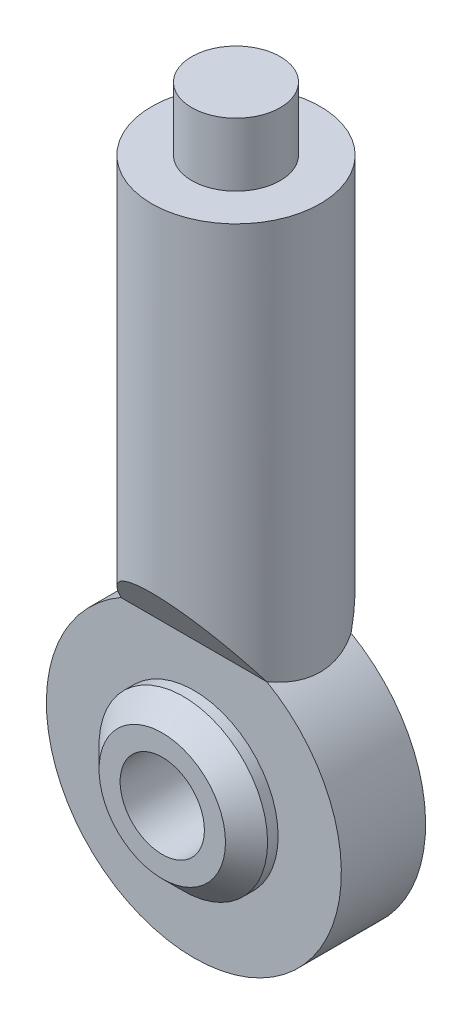
ISO-10303-21;
HEADER;
FILE_DESCRIPTION(('STEP AP214'),'2;1');
FILE_NAME('part.step','',(''),(''),'','','');
FILE_SCHEMA(('AUTOMOTIVE_DESIGN { 1 0 10303 214 1 1 1 1 }'));
ENDSEC;
DATA;
#1=APPLICATION_CONTEXT('core data for automotive mechanical design processes');
#2=APPLICATION_PROTOCOL_DEFINITION('international standard','automotive_design',2000,#1);
#3=PRODUCT_CONTEXT('',#1,'mechanical');
#4=PRODUCT('Part','Part','',(#3));
#5=PRODUCT_RELATED_PRODUCT_CATEGORY('part','',(#4));
#6=PRODUCT_DEFINITION_FORMATION('','',#4);
#7=PRODUCT_DEFINITION_CONTEXT('part definition',#1,'design');
#8=PRODUCT_DEFINITION('design','',#6,#7);
#9=PRODUCT_DEFINITION_SHAPE('','',#8);
#10=(LENGTH_UNIT() NAMED_UNIT(*) SI_UNIT(.MILLI.,.METRE.));
#11=(NAMED_UNIT(*) PLANE_ANGLE_UNIT() SI_UNIT($,.RADIAN.));
#12=(NAMED_UNIT(*) SI_UNIT($,.STERADIAN.) SOLID_ANGLE_UNIT());
#13=UNCERTAINTY_MEASURE_WITH_UNIT(LENGTH_MEASURE(1.E-05),#10,'distance_accuracy_value','');
#14=(GEOMETRIC_REPRESENTATION_CONTEXT(3) GLOBAL_UNCERTAINTY_ASSIGNED_CONTEXT((#13)) GLOBAL_UNIT_ASSIGNED_CONTEXT((#10,
#11,#12)) REPRESENTATION_CONTEXT('',''));
#15=CARTESIAN_POINT('',(0.,0.,0.));
#16=DIRECTION('',(0.,0.,1.));
#17=DIRECTION('',(1.,0.,0.));
#18=AXIS2_PLACEMENT_3D('',#15,#16,#17);
#19=CARTESIAN_POINT('',(0.,0.,2.));
#20=DIRECTION('',(0.,0.,1.));
#21=DIRECTION('',(1.,0.,0.));
#22=AXIS2_PLACEMENT_3D('',#19,#20,#21);
#23=PLANE('',#22);
#24=CARTESIAN_POINT('',(0.,0.,2.));
#25=DIRECTION('',(0.,0.,1.));
#26=DIRECTION('',(1.,0.,0.));
#27=AXIS2_PLACEMENT_3D('',#24,#25,#26);
#28=CIRCLE('',#27,7.);
#29=CARTESIAN_POINT('',(-3.46410161513777,6.08276253029822,2.00000000000002));
#30=VERTEX_POINT('',#29);
#31=CARTESIAN_POINT('',(3.46410161513777,6.08276253029822,2.00000000000002));
#32=VERTEX_POINT('',#31);
#33=EDGE_CURVE('E52',#30,#32,#28,.T.);
#34=ORIENTED_EDGE('',*,*,#33,.T.);
#35=DIRECTION('',(1.,0.,0.));
#36=VECTOR('',#35,1.);
#37=CARTESIAN_POINT('',(-5.,6.08276253029822,2.00000000000002));
#38=LINE('',#37,#36);
#39=EDGE_CURVE('E75',#30,#32,#38,.T.);
#40=ORIENTED_EDGE('',*,*,#39,.F.);
#41=EDGE_LOOP('',(#34,#40));
#42=FACE_BOUND('',#41,.T.);
#43=CARTESIAN_POINT('',(0.,0.,2.));
#44=DIRECTION('',(0.,0.,1.));
#45=DIRECTION('',(1.,0.,0.));
#46=AXIS2_PLACEMENT_3D('',#43,#44,#45);
#47=CIRCLE('',#46,4.);
#48=CARTESIAN_POINT('',(4.,0.,2.));
#49=VERTEX_POINT('',#48);
#50=EDGE_CURVE('E88',#49,#49,#47,.T.);
#51=ORIENTED_EDGE('',*,*,#50,.F.);
#52=EDGE_LOOP('',(#51));
#53=FACE_BOUND('',#52,.T.);
#54=ADVANCED_FACE('F34',(#42,#53),#23,.T.);
#55=CARTESIAN_POINT('',(0.,0.,-2.));
#56=DIRECTION('',(0.,0.,1.));
#57=DIRECTION('',(1.,0.,0.));
#58=AXIS2_PLACEMENT_3D('',#55,#56,#57);
#59=PLANE('',#58);
#60=DIRECTION('',(1.,0.,0.));
#61=VECTOR('',#60,1.);
#62=CARTESIAN_POINT('',(-5.,6.08276253029822,-1.99999999999998));
#63=LINE('',#62,#61);
#64=CARTESIAN_POINT('',(-3.46410161513775,6.08276253029822,-1.99999999999998));
#65=VERTEX_POINT('',#64);
#66=CARTESIAN_POINT('',(3.46410161513775,6.08276253029822,-1.99999999999998));
#67=VERTEX_POINT('',#66);
#68=EDGE_CURVE('E76',#65,#67,#63,.T.);
#69=ORIENTED_EDGE('',*,*,#68,.T.);
#70=CARTESIAN_POINT('',(0.,0.,-2.));
#71=DIRECTION('',(0.,0.,1.));
#72=DIRECTION('',(1.,0.,0.));
#73=AXIS2_PLACEMENT_3D('',#70,#71,#72);
#74=CIRCLE('',#73,7.);
#75=EDGE_CURVE('E85',#65,#67,#74,.T.);
#76=ORIENTED_EDGE('',*,*,#75,.F.);
#77=EDGE_LOOP('',(#69,#76));
#78=FACE_BOUND('',#77,.T.);
#79=CARTESIAN_POINT('',(0.,0.,-2.));
#80=DIRECTION('',(0.,0.,1.));
#81=DIRECTION('',(1.,0.,0.));
#82=AXIS2_PLACEMENT_3D('',#79,#80,#81);
#83=CIRCLE('',#82,4.);
#84=CARTESIAN_POINT('',(4.,0.,-2.));
#85=VERTEX_POINT('',#84);
#86=EDGE_CURVE('E93',#85,#85,#83,.F.);
#87=ORIENTED_EDGE('',*,*,#86,.F.);
#88=EDGE_LOOP('',(#87));
#89=FACE_BOUND('',#88,.T.);
#90=ADVANCED_FACE('F86',(#78,#89),#59,.F.);
#91=CARTESIAN_POINT('',(0.,0.,2.));
#92=DIRECTION('',(0.,0.,-1.));
#93=DIRECTION('',(-1.,0.,0.));
#94=AXIS2_PLACEMENT_3D('',#91,#92,#93);
#95=CYLINDRICAL_SURFACE('',#94,7.);
#96=ORIENTED_EDGE('',*,*,#33,.F.);
#97=CARTESIAN_POINT('',(0.,7.,4.00000000000003));
#98=CARTESIAN_POINT('',(-0.103174353693697,6.99999916766608,3.99999907377856));
#99=CARTESIAN_POINT('',(-0.206380943793601,6.99771279419803,3.99600161518895));
#100=CARTESIAN_POINT('',(-0.412022231403471,6.98862259173911,3.98006116827584));
#101=CARTESIAN_POINT('',(-0.514456405807249,6.9818159384365,3.96811321240036));
#102=CARTESIAN_POINT('',(-0.717934780638677,6.96383614374592,3.93639259035255));
#103=CARTESIAN_POINT('',(-0.818975800015571,6.95265431743131,3.91660435987073));
#104=CARTESIAN_POINT('',(-1.01874471471558,6.92620670688288,3.86945904381504));
#105=CARTESIAN_POINT('',(-1.11747160371512,6.91093918050343,3.84209872932827));
#106=CARTESIAN_POINT('',(-1.40816161924452,6.85970259630012,3.7494279546662));
#107=CARTESIAN_POINT('',(-1.59584032587964,6.81818653388811,3.67333513050477));
#108=CARTESIAN_POINT('',(-1.95516204193538,6.72398397587056,3.49537340911178));
#109=CARTESIAN_POINT('',(-2.12680950125059,6.67130059340362,3.39351169400328));
#110=CARTESIAN_POINT('',(-2.46335779064466,6.55482935189651,3.15863044004658));
#111=CARTESIAN_POINT('',(-2.62687541249465,6.4905142322253,3.02389160124483));
#112=CARTESIAN_POINT('',(-2.93033153816757,6.35928931111331,2.73088476818159));
#113=CARTESIAN_POINT('',(-3.07024197621333,6.29237653599831,2.5725891828547));
#114=CARTESIAN_POINT('',(-3.33788766479094,6.15495683988651,2.21660733216358));
#115=CARTESIAN_POINT('',(-3.46264734932395,6.08484959478129,2.01650979018382));
#116=CARTESIAN_POINT('',(-3.67622523435091,5.95826038292871,1.59409940999441));
#117=CARTESIAN_POINT('',(-3.76509784562976,5.90175784209801,1.37182084496662));
#118=CARTESIAN_POINT('',(-3.88718686207776,5.82184477812116,0.961709681430863));
#119=CARTESIAN_POINT('',(-3.92836679668126,5.7938785104293,0.777136979922026));
#120=CARTESIAN_POINT('',(-3.98421352589058,5.75562678316024,0.402300520350382));
#121=CARTESIAN_POINT('',(-3.99890874126274,5.74532237121861,0.212043085805393));
#122=CARTESIAN_POINT('',(-4.000975196418,5.74388373656896,-0.168949347665514));
#123=CARTESIAN_POINT('',(-3.9883091206227,5.75277569403422,-0.359684643988187));
#124=CARTESIAN_POINT('',(-3.93632981744011,5.78845897302995,-0.735805094015829));
#125=CARTESIAN_POINT('',(-3.89699825572749,5.81526260986988,-0.921186475046951));
#126=CARTESIAN_POINT('',(-3.79383546739156,5.88307389939548,-1.28132955014227));
#127=CARTESIAN_POINT('',(-3.73009950434547,5.92402626197588,-1.45612951440863));
#128=CARTESIAN_POINT('',(-3.58033837481383,6.01571820888122,-1.79310086238778));
#129=CARTESIAN_POINT('',(-3.49430468035283,6.06646153595043,-1.9552673833917));
#130=CARTESIAN_POINT('',(-3.28648201894194,6.18185421346707,-2.28994078044742));
#131=CARTESIAN_POINT('',(-3.1611726088396,6.24742890906936,-2.45994019405351));
#132=CARTESIAN_POINT('',(-2.88547978627879,6.37944698360955,-2.77818874560388));
#133=CARTESIAN_POINT('',(-2.73507500002898,6.44589105816034,-2.92641913874011));
#134=CARTESIAN_POINT('',(-2.48331031323023,6.54542571666137,-3.13799899016948));
#135=CARTESIAN_POINT('',(-2.38969010220767,6.58026752098845,-3.2098883108521));
#136=CARTESIAN_POINT('',(-2.19586698303155,6.64745587466658,-3.34546570152993));
#137=CARTESIAN_POINT('',(-2.09566676634966,6.67980343263155,-3.40915709361981));
#138=CARTESIAN_POINT('',(-1.889204002549,6.74110581212484,-3.52775900492854));
#139=CARTESIAN_POINT('',(-1.78294128516186,6.77006053829395,-3.58266927736037));
#140=CARTESIAN_POINT('',(-1.56508258052671,6.82371510380378,-3.68305410070041));
#141=CARTESIAN_POINT('',(-1.45348987750213,6.84841752119956,-3.72853437219748));
#142=CARTESIAN_POINT('',(-1.2335757790331,6.89129649283952,-3.80669931479188));
#143=CARTESIAN_POINT('',(-1.12555499053737,6.90980443827147,-3.84004766376687));
#144=CARTESIAN_POINT('',(-0.906444721241725,6.94194552986212,-3.89758615921543));
#145=CARTESIAN_POINT('',(-0.795356928634575,6.95558130240596,-3.92178124024863));
#146=CARTESIAN_POINT('',(-0.571076021606556,6.97757559140464,-3.96065880106725));
#147=CARTESIAN_POINT('',(-0.457884145982404,6.98593711776119,-3.97534670652386));
#148=CARTESIAN_POINT('',(-0.230391688469561,6.99713394609541,-3.99499057470808));
#149=CARTESIAN_POINT('',(-0.116091232128093,6.99996986667267,-3.99994762681932));
#150=CARTESIAN_POINT('',(0.098598515755152,7.00002603570934,-4.00004524614223));
#151=CARTESIAN_POINT('',(0.198989300897778,6.99788721407676,-3.99630619612816));
#152=CARTESIAN_POINT('',(0.399056378144481,6.98933343073185,-3.98130882132309));
#153=CARTESIAN_POINT('',(0.498732436984928,6.98291713194041,-3.97004814537565));
#154=CARTESIAN_POINT('',(0.696577503138301,6.96596218341932,-3.94014996542461));
#155=CARTESIAN_POINT('',(0.794747081263238,6.95542513725049,-3.92151533091342));
#156=CARTESIAN_POINT('',(0.988966675044392,6.93048013582528,-3.87709770270347));
#157=CARTESIAN_POINT('',(1.08501585796256,6.91607068803824,-3.85131195264434));
#158=CARTESIAN_POINT('',(1.36702487624933,6.86784025244504,-3.76425178907955));
#159=CARTESIAN_POINT('',(1.54910864022513,6.82881174027116,-3.69292384409024));
#160=CARTESIAN_POINT('',(1.89874210569062,6.73998795964161,-3.52596286256885));
#161=CARTESIAN_POINT('',(2.06628829476744,6.69019009930531,-3.43032397409962));
#162=CARTESIAN_POINT('',(2.40101022734591,6.57794997192013,-3.2062140714796));
#163=CARTESIAN_POINT('',(2.56633212812789,6.51473109707346,-3.07536179531594));
#164=CARTESIAN_POINT('',(2.87394702055108,6.38501165185068,-2.79007620556994));
#165=CARTESIAN_POINT('',(3.01621327559793,6.31850738648143,-2.63561591232811));
#166=CARTESIAN_POINT('',(3.28985374296218,6.1808435227324,-2.28719509976019));
#167=CARTESIAN_POINT('',(3.41824351694382,6.10999195942493,-2.0907504418171));
#168=CARTESIAN_POINT('',(3.63986774300697,5.98062693471643,-1.67529069821978));
#169=CARTESIAN_POINT('',(3.73314891565779,5.92209712227822,-1.4563061054957));
#170=CARTESIAN_POINT('',(3.86444214295347,5.83702467135119,-1.04952947883425));
#171=CARTESIAN_POINT('',(3.90999905451075,5.80632211246573,-0.865047018314353));
#172=CARTESIAN_POINT('',(3.9744867486248,5.76238064526141,-0.489531814935945));
#173=CARTESIAN_POINT('',(3.99344782797955,5.74912186682822,-0.298506779735318));
#174=CARTESIAN_POINT('',(4.00370381772298,5.74198624338643,0.0850455450714547));
#175=CARTESIAN_POINT('',(3.9949430276323,5.74814842005171,0.277575082842396));
#176=CARTESIAN_POINT('',(3.95016772474909,5.77900279264678,0.65795427962015));
#177=CARTESIAN_POINT('',(3.9141359745247,5.80370670835904,0.84580090104658));
#178=CARTESIAN_POINT('',(3.81754070421717,5.86767618941698,1.20875134639438));
#179=CARTESIAN_POINT('',(3.75741242514338,5.90668241023302,1.38401941400972));
#180=CARTESIAN_POINT('',(3.61484445738469,5.99499093748335,1.72239789386604));
#181=CARTESIAN_POINT('',(3.53239654118209,6.04429703915073,1.88550379452539));
#182=CARTESIAN_POINT('',(3.33286050522202,6.15687101376706,2.22168794717743));
#183=CARTESIAN_POINT('',(3.21239325811873,6.22111967308758,2.39243428434695));
#184=CARTESIAN_POINT('',(2.94678350974008,6.35125248551337,2.71291013955076));
#185=CARTESIAN_POINT('',(2.80161960176933,6.41713801476199,2.86262121722511));
#186=CARTESIAN_POINT('',(2.46904766832851,6.55284552282303,3.15574307766574));
#187=CARTESIAN_POINT('',(2.27863050588138,6.62213671268147,3.29605019117405));
#188=CARTESIAN_POINT('',(1.97466957376768,6.71654843840246,3.48062955700553));
#189=CARTESIAN_POINT('',(1.87025550480297,6.74643988436931,3.53785722937425));
#190=CARTESIAN_POINT('',(1.65585314541166,6.80223377050488,3.64312862221177));
#191=CARTESIAN_POINT('',(1.54586640130947,6.82813730928139,3.69117487290574));
#192=CARTESIAN_POINT('',(1.34112548315165,6.87097539991195,3.76977226195681));
#193=CARTESIAN_POINT('',(1.24713982863986,6.88868575445997,3.80191515074172));
#194=CARTESIAN_POINT('',(1.05647742318429,6.92049045413031,3.85924321854376));
#195=CARTESIAN_POINT('',(0.959801151524329,6.9345854387517,3.88442962810746));
#196=CARTESIAN_POINT('',(0.764604083132345,6.95880963464549,3.92751165707027));
#197=CARTESIAN_POINT('',(0.66608841404705,6.96894852493489,3.94542507505117));
#198=CARTESIAN_POINT('',(0.467694279786065,6.98506655367338,3.97382595093296));
#199=CARTESIAN_POINT('',(0.367816622968048,6.99104805863874,3.98431763358274));
#200=CARTESIAN_POINT('',(0.223113454646585,6.99658555791355,3.99402226844822));
#201=CARTESIAN_POINT('',(0.178534436572916,6.99786511874742,3.99626297726964));
#202=CARTESIAN_POINT('',(0.0893056299289705,6.99957256458765,3.99925212176124));
#203=CARTESIAN_POINT('',(0.0446558344262021,7.00000036025005,4.0000004008864));
#204=CARTESIAN_POINT('',(0.,7.,4.00000000000003));
#205=B_SPLINE_CURVE_WITH_KNOTS('',3,(#97,#98,#99,#100,#101,#102,#103,#104,#105,#106,#107,#108,
#109,#110,#111,#112,#113,#114,#115,#116,#117,#118,#119,#120,#121,#122,#123,#124,#125,#126,#127,
#128,#129,#130,#131,#132,#133,#134,#135,#136,#137,#138,#139,#140,#141,#142,#143,#144,#145,#146,
#147,#148,#149,#150,#151,#152,#153,#154,#155,#156,#157,#158,#159,#160,#161,#162,#163,#164,#165,
#166,#167,#168,#169,#170,#171,#172,#173,#174,#175,#176,#177,#178,#179,#180,#181,#182,#183,#184,
#185,#186,#187,#188,#189,#190,#191,#192,#193,#194,#195,#196,#197,#198,#199,#200,#201,#202,#203,
#204),.UNSPECIFIED.,.T.,.F.,(4,2,2,2,2,2,2,2,2,2,2,2,2,2,2,2,2,2,2,2,2,2,2,2,2,2,2,2,2,2,2,2,2,
2,2,2,2,2,2,2,2,2,2,2,2,2,2,2,2,2,2,2,2,4),(0.,0.309476324047613,0.619146193855395,
0.929433917393153,1.23985415925134,1.85706150441802,2.47409701507639,3.13570852611814,
3.79810114556278,4.53248005222482,5.26574129924115,5.83676638409033,6.40717833593583,
6.97836871188834,7.54995221869045,8.11932690485234,8.6889196758526,9.34979048117592,
10.0112270520965,10.3800420446256,10.7487071063677,11.1173825273551,11.4858336375217,
11.829013046234,12.172007181154,12.5148053990004,12.8575652378825,13.1586456412119,
13.4598202021895,13.7608776795699,14.0620513596593,14.6575858081394,15.2532637449138,
15.910945217437,16.5693839988404,17.3012585698566,18.0321557302083,18.6071545432669,
19.1814978096213,19.7569958138959,20.3328578831257,20.898756255232,21.4648635148624,
22.118143381826,22.7719924141757,23.5072264951886,23.87508904646,24.2428500751504,
24.5452250849504,24.8475465726779,25.1491236891176,25.4505289973437,25.5844622240579,
25.7184094986542),.UNSPECIFIED.);
#206=EDGE_CURVE('E11',#30,#65,#205,.T.);
#207=ORIENTED_EDGE('',*,*,#206,.T.);
#208=ORIENTED_EDGE('',*,*,#75,.T.);
#209=EDGE_CURVE('E38',#67,#32,#205,.T.);
#210=ORIENTED_EDGE('',*,*,#209,.T.);
#211=EDGE_LOOP('',(#96,#207,#208,#210));
#212=FACE_BOUND('',#211,.T.);
#213=ADVANCED_FACE('F84',(#212),#95,.T.);
#214=CARTESIAN_POINT('',(0.,0.,3.5));
#215=DIRECTION('',(0.,0.,-1.));
#216=DIRECTION('',(-1.,0.,0.));
#217=AXIS2_PLACEMENT_3D('',#214,#215,#216);
#218=CYLINDRICAL_SURFACE('',#217,4.);
#219=CARTESIAN_POINT('',(0.,0.,-2.5));
#220=DIRECTION('',(0.,0.,1.));
#221=DIRECTION('',(1.,0.,0.));
#222=AXIS2_PLACEMENT_3D('',#219,#220,#221);
#223=CIRCLE('',#222,4.);
#224=CARTESIAN_POINT('',(4.,0.,-2.5));
#225=VERTEX_POINT('',#224);
#226=EDGE_CURVE('E90',#225,#225,#223,.T.);
#227=ORIENTED_EDGE('',*,*,#226,.T.);
#228=EDGE_LOOP('',(#227));
#229=FACE_BOUND('',#228,.T.);
#230=ORIENTED_EDGE('',*,*,#86,.T.);
#231=EDGE_LOOP('',(#230));
#232=FACE_BOUND('',#231,.T.);
#233=ADVANCED_FACE('F119',(#229,#232),#218,.T.);
#234=CARTESIAN_POINT('',(0.,0.,3.5));
#235=DIRECTION('',(0.,0.,1.));
#236=DIRECTION('',(1.,0.,0.));
#237=AXIS2_PLACEMENT_3D('',#234,#235,#236);
#238=PLANE('',#237);
#239=CARTESIAN_POINT('',(0.,0.,3.5));
#240=DIRECTION('',(0.,0.,1.));
#241=DIRECTION('',(1.,0.,0.));
#242=AXIS2_PLACEMENT_3D('',#239,#240,#241);
#243=CIRCLE('',#242,3.);
#244=CARTESIAN_POINT('',(3.,0.,3.5));
#245=VERTEX_POINT('',#244);
#246=EDGE_CURVE('E101',#245,#245,#243,.T.);
#247=ORIENTED_EDGE('',*,*,#246,.T.);
#248=EDGE_LOOP('',(#247));
#249=FACE_BOUND('',#248,.T.);
#250=CARTESIAN_POINT('',(0.,0.,3.5));
#251=DIRECTION('',(0.,0.,1.));
#252=DIRECTION('',(1.,0.,0.));
#253=AXIS2_PLACEMENT_3D('',#250,#251,#252);
#254=CIRCLE('',#253,2.);
#255=CARTESIAN_POINT('',(2.,0.,3.5));
#256=VERTEX_POINT('',#255);
#257=EDGE_CURVE('E123',#256,#256,#254,.T.);
#258=ORIENTED_EDGE('',*,*,#257,.F.);
#259=EDGE_LOOP('',(#258));
#260=FACE_BOUND('',#259,.T.);
#261=ADVANCED_FACE('F115',(#249,#260),#238,.T.);
#262=CARTESIAN_POINT('',(0.,0.,-3.5));
#263=DIRECTION('',(0.,0.,1.));
#264=DIRECTION('',(1.,0.,0.));
#265=AXIS2_PLACEMENT_3D('',#262,#263,#264);
#266=PLANE('',#265);
#267=CARTESIAN_POINT('',(0.,0.,-3.5));
#268=DIRECTION('',(0.,0.,1.));
#269=DIRECTION('',(1.,0.,0.));
#270=AXIS2_PLACEMENT_3D('',#267,#268,#269);
#271=CIRCLE('',#270,3.);
#272=CARTESIAN_POINT('',(3.,0.,-3.5));
#273=VERTEX_POINT('',#272);
#274=EDGE_CURVE('E98',#273,#273,#271,.F.);
#275=ORIENTED_EDGE('',*,*,#274,.T.);
#276=EDGE_LOOP('',(#275));
#277=FACE_BOUND('',#276,.T.);
#278=CARTESIAN_POINT('',(0.,0.,-3.5));
#279=DIRECTION('',(0.,0.,1.));
#280=DIRECTION('',(1.,0.,0.));
#281=AXIS2_PLACEMENT_3D('',#278,#279,#280);
#282=CIRCLE('',#281,2.);
#283=CARTESIAN_POINT('',(2.,0.,-3.5));
#284=VERTEX_POINT('',#283);
#285=EDGE_CURVE('E125',#284,#284,#282,.T.);
#286=ORIENTED_EDGE('',*,*,#285,.T.);
#287=EDGE_LOOP('',(#286));
#288=FACE_BOUND('',#287,.T.);
#289=ADVANCED_FACE('F118',(#277,#288),#266,.F.);
#290=CARTESIAN_POINT('',(0.,0.,2.5));
#291=DIRECTION('',(0.,0.,1.));
#292=DIRECTION('',(1.,0.,0.));
#293=AXIS2_PLACEMENT_3D('',#290,#291,#292);
#294=CIRCLE('',#293,4.);
#295=CARTESIAN_POINT('',(4.,0.,2.5));
#296=VERTEX_POINT('',#295);
#297=EDGE_CURVE('E103',#296,#296,#294,.F.);
#298=ORIENTED_EDGE('',*,*,#297,.T.);
#299=EDGE_LOOP('',(#298));
#300=FACE_BOUND('',#299,.T.);
#301=ORIENTED_EDGE('',*,*,#50,.T.);
#302=EDGE_LOOP('',(#301));
#303=FACE_BOUND('',#302,.T.);
#304=ADVANCED_FACE('F107',(#300,#303),#218,.T.);
#305=CARTESIAN_POINT('',(0.,0.,3.5));
#306=DIRECTION('',(0.,0.,-1.));
#307=DIRECTION('',(-1.,0.,0.));
#308=AXIS2_PLACEMENT_3D('',#305,#306,#307);
#309=CYLINDRICAL_SURFACE('',#308,2.);
#310=ORIENTED_EDGE('',*,*,#257,.T.);
#311=EDGE_LOOP('',(#310));
#312=FACE_BOUND('',#311,.T.);
#313=ORIENTED_EDGE('',*,*,#285,.F.);
#314=EDGE_LOOP('',(#313));
#315=FACE_BOUND('',#314,.T.);
#316=ADVANCED_FACE('F174',(#312,#315),#309,.F.);
#317=CARTESIAN_POINT('',(0.,0.,-2.5));
#318=DIRECTION('',(0.,0.,1.));
#319=DIRECTION('',(1.,0.,0.));
#320=AXIS2_PLACEMENT_3D('',#317,#318,#319);
#321=CONICAL_SURFACE('',#320,4.,0.785398163397451);
#322=ORIENTED_EDGE('',*,*,#274,.F.);
#323=EDGE_LOOP('',(#322));
#324=FACE_BOUND('',#323,.T.);
#325=ORIENTED_EDGE('',*,*,#226,.F.);
#326=EDGE_LOOP('',(#325));
#327=FACE_BOUND('',#326,.T.);
#328=ADVANCED_FACE('F112',(#324,#327),#321,.T.);
#329=CARTESIAN_POINT('',(0.,0.,3.5));
#330=DIRECTION('',(0.,0.,-1.));
#331=DIRECTION('',(-1.,0.,0.));
#332=AXIS2_PLACEMENT_3D('',#329,#330,#331);
#333=CONICAL_SURFACE('',#332,3.,0.785398163397447);
#334=ORIENTED_EDGE('',*,*,#297,.F.);
#335=EDGE_LOOP('',(#334));
#336=FACE_BOUND('',#335,.T.);
#337=ORIENTED_EDGE('',*,*,#246,.F.);
#338=EDGE_LOOP('',(#337));
#339=FACE_BOUND('',#338,.T.);
#340=ADVANCED_FACE('F36',(#336,#339),#333,.T.);
#341=CARTESIAN_POINT('',(0.,5.,0.));
#342=DIRECTION('',(0.,1.,0.));
#343=DIRECTION('',(0.,0.,1.));
#344=AXIS2_PLACEMENT_3D('',#341,#342,#343);
#345=CYLINDRICAL_SURFACE('',#344,4.);
#346=CARTESIAN_POINT('',(0.,3.16552506059644,0.));
#347=DIRECTION('',(0.,0.565453083800761,0.824780461711));
#348=DIRECTION('',(0.,0.824780461711,-0.565453083800761));
#349=AXIS2_PLACEMENT_3D('',#346,#347,#348);
#350=ELLIPSE('',#349,7.07397326956553,4.);
#351=EDGE_CURVE('E68',#65,#67,#350,.F.);
#352=ORIENTED_EDGE('',*,*,#351,.F.);
#353=ORIENTED_EDGE('',*,*,#206,.F.);
#354=CARTESIAN_POINT('',(0.,3.16552506059639,0.));
#355=DIRECTION('',(0.,0.565453083800755,-0.824780461711004));
#356=DIRECTION('',(0.,0.824780461711004,0.565453083800755));
#357=AXIS2_PLACEMENT_3D('',#354,#355,#356);
#358=ELLIPSE('',#357,7.07397326956568,4.);
#359=EDGE_CURVE('E58',#32,#30,#358,.F.);
#360=ORIENTED_EDGE('',*,*,#359,.F.);
#361=ORIENTED_EDGE('',*,*,#209,.F.);
#362=EDGE_LOOP('',(#352,#353,#360,#361));
#363=FACE_BOUND('',#362,.T.);
#364=CARTESIAN_POINT('',(0.,25.,0.));
#365=DIRECTION('',(0.,1.,0.));
#366=DIRECTION('',(0.,0.,1.));
#367=AXIS2_PLACEMENT_3D('',#364,#365,#366);
#368=CIRCLE('',#367,4.);
#369=CARTESIAN_POINT('',(0.,25.,4.0000000000001));
#370=VERTEX_POINT('',#369);
#371=EDGE_CURVE('E130',#370,#370,#368,.T.);
#372=ORIENTED_EDGE('',*,*,#371,.F.);
#373=EDGE_LOOP('',(#372));
#374=FACE_BOUND('',#373,.T.);
#375=ADVANCED_FACE('F70',(#363,#374),#345,.T.);
#376=CARTESIAN_POINT('',(0.,25.,0.));
#377=DIRECTION('',(0.,1.,0.));
#378=DIRECTION('',(0.,0.,1.));
#379=AXIS2_PLACEMENT_3D('',#376,#377,#378);
#380=PLANE('',#379);
#381=CARTESIAN_POINT('',(0.,25.,0.));
#382=DIRECTION('',(0.,1.,0.));
#383=DIRECTION('',(0.,0.,1.));
#384=AXIS2_PLACEMENT_3D('',#381,#382,#383);
#385=CIRCLE('',#384,2.1);
#386=CARTESIAN_POINT('',(0.,25.,2.1000000000001));
#387=VERTEX_POINT('',#386);
#388=EDGE_CURVE('E137',#387,#387,#385,.T.);
#389=ORIENTED_EDGE('',*,*,#388,.F.);
#390=EDGE_LOOP('',(#389));
#391=FACE_BOUND('',#390,.T.);
#392=ORIENTED_EDGE('',*,*,#371,.T.);
#393=EDGE_LOOP('',(#392));
#394=FACE_BOUND('',#393,.T.);
#395=ADVANCED_FACE('F151',(#391,#394),#380,.T.);
#396=CARTESIAN_POINT('',(-5.,6.08276253029822,2.00000000000002));
#397=DIRECTION('',(0.,0.565453083800755,-0.824780461711004));
#398=DIRECTION('',(0.,0.824780461711004,0.565453083800755));
#399=AXIS2_PLACEMENT_3D('',#396,#397,#398);
#400=PLANE('',#399);
#401=ORIENTED_EDGE('',*,*,#359,.T.);
#402=ORIENTED_EDGE('',*,*,#39,.T.);
#403=EDGE_LOOP('',(#401,#402));
#404=FACE_BOUND('',#403,.T.);
#405=ADVANCED_FACE('F154',(#404),#400,.F.);
#406=CARTESIAN_POINT('',(-5.,6.08276253029822,-1.99999999999998));
#407=DIRECTION('',(0.,0.565453083800761,0.824780461711));
#408=DIRECTION('',(0.,-0.824780461711,0.565453083800761));
#409=AXIS2_PLACEMENT_3D('',#406,#407,#408);
#410=PLANE('',#409);
#411=ORIENTED_EDGE('',*,*,#351,.T.);
#412=ORIENTED_EDGE('',*,*,#68,.F.);
#413=EDGE_LOOP('',(#411,#412));
#414=FACE_BOUND('',#413,.T.);
#415=ADVANCED_FACE('F78',(#414),#410,.F.);
#416=CARTESIAN_POINT('',(0.,28.,1.06276099032243E-13));
#417=DIRECTION('',(0.,-1.,0.));
#418=DIRECTION('',(0.,0.,-1.));
#419=AXIS2_PLACEMENT_3D('',#416,#417,#418);
#420=CYLINDRICAL_SURFACE('',#419,2.1);
#421=CARTESIAN_POINT('',(0.,28.,1.06276099032243E-13));
#422=DIRECTION('',(0.,1.,0.));
#423=DIRECTION('',(0.,0.,1.));
#424=AXIS2_PLACEMENT_3D('',#421,#422,#423);
#425=CIRCLE('',#424,2.1);
#426=CARTESIAN_POINT('',(0.,28.,2.10000000000011));
#427=VERTEX_POINT('',#426);
#428=EDGE_CURVE('E81',#427,#427,#425,.T.);
#429=ORIENTED_EDGE('',*,*,#428,.F.);
#430=EDGE_LOOP('',(#429));
#431=FACE_BOUND('',#430,.T.);
#432=ORIENTED_EDGE('',*,*,#388,.T.);
#433=EDGE_LOOP('',(#432));
#434=FACE_BOUND('',#433,.T.);
#435=ADVANCED_FACE('F145',(#431,#434),#420,.T.);
#436=CARTESIAN_POINT('',(0.,28.,1.06276099032243E-13));
#437=DIRECTION('',(0.,1.,0.));
#438=DIRECTION('',(0.,0.,1.));
#439=AXIS2_PLACEMENT_3D('',#436,#437,#438);
#440=PLANE('',#439);
#441=ORIENTED_EDGE('',*,*,#428,.T.);
#442=EDGE_LOOP('',(#441));
#443=FACE_BOUND('',#442,.T.);
#444=ADVANCED_FACE('F143',(#443),#440,.T.);
#445=CLOSED_SHELL('',(#54,#90,#213,#233,#261,#289,#304,#316,#328,#340,#375,#395,#405,#415,#435,#444));
#446=MANIFOLD_SOLID_BREP('B2',#445);
#447=ADVANCED_BREP_SHAPE_REPRESENTATION('',(#18,#446),#14);
#448=SHAPE_DEFINITION_REPRESENTATION(#9,#447);
ENDSEC;
END-ISO-10303-21;
